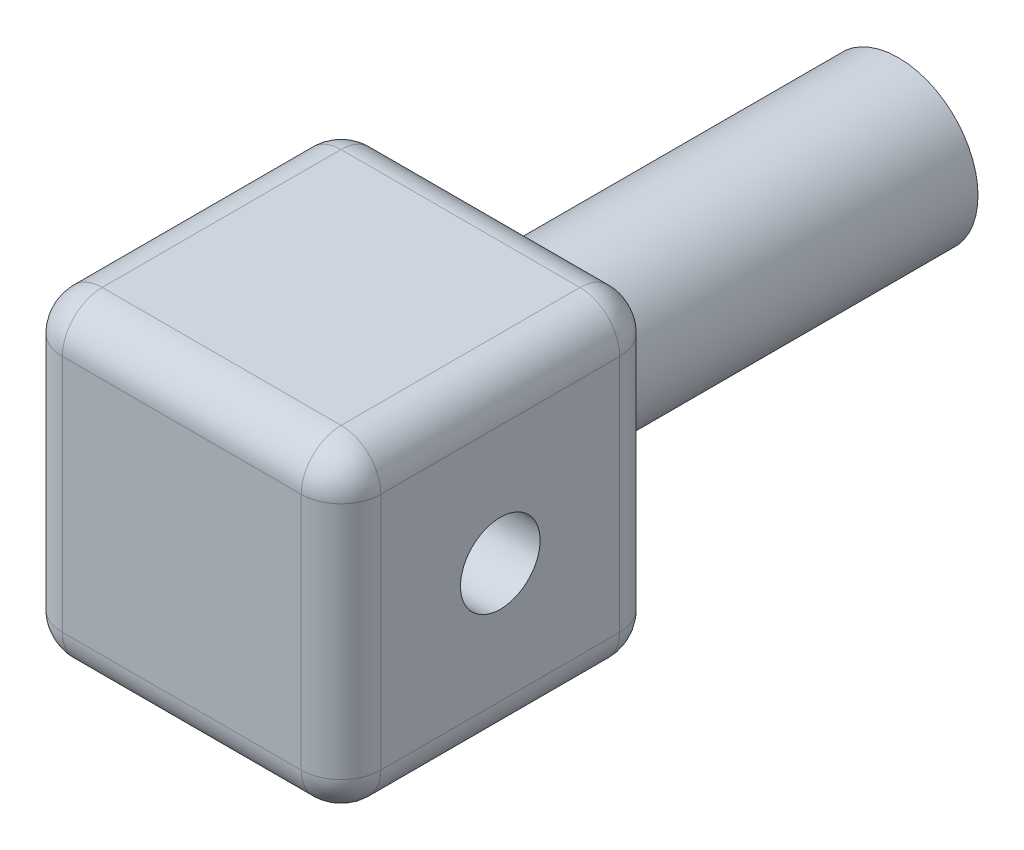
ISO-10303-21;
HEADER;
FILE_DESCRIPTION(('STEP AP214'),'2;1');
FILE_NAME('part.step','',(''),(''),'','','');
FILE_SCHEMA(('AUTOMOTIVE_DESIGN { 1 0 10303 214 1 1 1 1 }'));
ENDSEC;
DATA;
#1=APPLICATION_CONTEXT('core data for automotive mechanical design processes');
#2=APPLICATION_PROTOCOL_DEFINITION('international standard','automotive_design',2000,#1);
#3=PRODUCT_CONTEXT('',#1,'mechanical');
#4=PRODUCT('Part','Part','',(#3));
#5=PRODUCT_RELATED_PRODUCT_CATEGORY('part','',(#4));
#6=PRODUCT_DEFINITION_FORMATION('','',#4);
#7=PRODUCT_DEFINITION_CONTEXT('part definition',#1,'design');
#8=PRODUCT_DEFINITION('design','',#6,#7);
#9=PRODUCT_DEFINITION_SHAPE('','',#8);
#10=(LENGTH_UNIT() NAMED_UNIT(*) SI_UNIT(.MILLI.,.METRE.));
#11=(NAMED_UNIT(*) PLANE_ANGLE_UNIT() SI_UNIT($,.RADIAN.));
#12=(NAMED_UNIT(*) SI_UNIT($,.STERADIAN.) SOLID_ANGLE_UNIT());
#13=UNCERTAINTY_MEASURE_WITH_UNIT(LENGTH_MEASURE(1.E-05),#10,'distance_accuracy_value','');
#14=(GEOMETRIC_REPRESENTATION_CONTEXT(3) GLOBAL_UNCERTAINTY_ASSIGNED_CONTEXT((#13)) GLOBAL_UNIT_ASSIGNED_CONTEXT((#10,
#11,#12)) REPRESENTATION_CONTEXT('',''));
#15=CARTESIAN_POINT('',(0.,0.,0.));
#16=DIRECTION('',(0.,0.,1.));
#17=DIRECTION('',(1.,0.,0.));
#18=AXIS2_PLACEMENT_3D('',#15,#16,#17);
#19=CARTESIAN_POINT('',(40.,40.,80.));
#20=DIRECTION('',(-1.,0.,0.));
#21=DIRECTION('',(0.,-1.,0.));
#22=AXIS2_PLACEMENT_3D('',#19,#20,#21);
#23=PLANE('',#22);
#24=CARTESIAN_POINT('',(40.,0.,40.));
#25=DIRECTION('',(-1.,0.,0.));
#26=DIRECTION('',(0.,-1.,0.));
#27=AXIS2_PLACEMENT_3D('',#24,#25,#26);
#28=CIRCLE('',#27,10.);
#29=CARTESIAN_POINT('',(40.,-10.,40.));
#30=VERTEX_POINT('',#29);
#31=EDGE_CURVE('E392',#30,#30,#28,.F.);
#32=ORIENTED_EDGE('',*,*,#31,.F.);
#33=EDGE_LOOP('',(#32));
#34=FACE_BOUND('',#33,.T.);
#35=DIRECTION('',(0.,0.,-1.));
#36=VECTOR('',#35,1.);
#37=CARTESIAN_POINT('',(40.,30.,80.));
#38=LINE('',#37,#36);
#39=CARTESIAN_POINT('',(40.,30.,9.99999999999999));
#40=VERTEX_POINT('',#39);
#41=CARTESIAN_POINT('',(40.,30.,70.));
#42=VERTEX_POINT('',#41);
#43=EDGE_CURVE('E182',#40,#42,#38,.F.);
#44=ORIENTED_EDGE('',*,*,#43,.T.);
#45=DIRECTION('',(0.,1.,0.));
#46=VECTOR('',#45,1.);
#47=CARTESIAN_POINT('',(40.,-40.,70.));
#48=LINE('',#47,#46);
#49=CARTESIAN_POINT('',(40.,-30.,70.));
#50=VERTEX_POINT('',#49);
#51=EDGE_CURVE('E187',#42,#50,#48,.F.);
#52=ORIENTED_EDGE('',*,*,#51,.T.);
#53=DIRECTION('',(0.,0.,-1.));
#54=VECTOR('',#53,1.);
#55=CARTESIAN_POINT('',(40.,-30.,80.));
#56=LINE('',#55,#54);
#57=CARTESIAN_POINT('',(40.,-30.,9.99999999999999));
#58=VERTEX_POINT('',#57);
#59=EDGE_CURVE('E184',#50,#58,#56,.T.);
#60=ORIENTED_EDGE('',*,*,#59,.T.);
#61=DIRECTION('',(0.,1.,0.));
#62=VECTOR('',#61,1.);
#63=CARTESIAN_POINT('',(40.,40.,9.99999999999999));
#64=LINE('',#63,#62);
#65=EDGE_CURVE('E180',#58,#40,#64,.T.);
#66=ORIENTED_EDGE('',*,*,#65,.T.);
#67=EDGE_LOOP('',(#44,#52,#60,#66));
#68=FACE_BOUND('',#67,.T.);
#69=ADVANCED_FACE('F35',(#34,#68),#23,.F.);
#70=CARTESIAN_POINT('',(-40.,40.,80.));
#71=DIRECTION('',(0.,-1.,0.));
#72=DIRECTION('',(0.,0.,-1.));
#73=AXIS2_PLACEMENT_3D('',#70,#71,#72);
#74=PLANE('',#73);
#75=DIRECTION('',(-1.,0.,0.));
#76=VECTOR('',#75,1.);
#77=CARTESIAN_POINT('',(40.,40.,70.));
#78=LINE('',#77,#76);
#79=CARTESIAN_POINT('',(-30.,40.,70.));
#80=VERTEX_POINT('',#79);
#81=CARTESIAN_POINT('',(30.,40.,70.));
#82=VERTEX_POINT('',#81);
#83=EDGE_CURVE('E50',#80,#82,#78,.F.);
#84=ORIENTED_EDGE('',*,*,#83,.T.);
#85=DIRECTION('',(0.,0.,-1.));
#86=VECTOR('',#85,1.);
#87=CARTESIAN_POINT('',(30.,40.,80.));
#88=LINE('',#87,#86);
#89=CARTESIAN_POINT('',(30.,40.,9.99999999999999));
#90=VERTEX_POINT('',#89);
#91=EDGE_CURVE('E43',#82,#90,#88,.T.);
#92=ORIENTED_EDGE('',*,*,#91,.T.);
#93=DIRECTION('',(-1.,0.,0.));
#94=VECTOR('',#93,1.);
#95=CARTESIAN_POINT('',(-40.,40.,9.99999999999999));
#96=LINE('',#95,#94);
#97=CARTESIAN_POINT('',(-30.,40.,9.99999999999999));
#98=VERTEX_POINT('',#97);
#99=EDGE_CURVE('E198',#90,#98,#96,.T.);
#100=ORIENTED_EDGE('',*,*,#99,.T.);
#101=DIRECTION('',(0.,0.,-1.));
#102=VECTOR('',#101,1.);
#103=CARTESIAN_POINT('',(-30.,40.,80.));
#104=LINE('',#103,#102);
#105=EDGE_CURVE('E55',#98,#80,#104,.F.);
#106=ORIENTED_EDGE('',*,*,#105,.T.);
#107=EDGE_LOOP('',(#84,#92,#100,#106));
#108=FACE_BOUND('',#107,.T.);
#109=ADVANCED_FACE('F301',(#108),#74,.F.);
#110=CARTESIAN_POINT('',(-40.,40.,80.));
#111=DIRECTION('',(1.,0.,0.));
#112=DIRECTION('',(0.,1.,0.));
#113=AXIS2_PLACEMENT_3D('',#110,#111,#112);
#114=PLANE('',#113);
#115=CARTESIAN_POINT('',(-40.,0.,40.));
#116=DIRECTION('',(-1.,0.,0.));
#117=DIRECTION('',(0.,-1.,0.));
#118=AXIS2_PLACEMENT_3D('',#115,#116,#117);
#119=CIRCLE('',#118,10.);
#120=CARTESIAN_POINT('',(-40.,-10.,40.));
#121=VERTEX_POINT('',#120);
#122=EDGE_CURVE('E394',#121,#121,#119,.T.);
#123=ORIENTED_EDGE('',*,*,#122,.F.);
#124=EDGE_LOOP('',(#123));
#125=FACE_BOUND('',#124,.T.);
#126=DIRECTION('',(0.,0.,-1.));
#127=VECTOR('',#126,1.);
#128=CARTESIAN_POINT('',(-40.,-30.,80.));
#129=LINE('',#128,#127);
#130=CARTESIAN_POINT('',(-40.,-30.,9.99999999999999));
#131=VERTEX_POINT('',#130);
#132=CARTESIAN_POINT('',(-40.,-30.,70.));
#133=VERTEX_POINT('',#132);
#134=EDGE_CURVE('E130',#131,#133,#129,.F.);
#135=ORIENTED_EDGE('',*,*,#134,.T.);
#136=DIRECTION('',(0.,-1.,0.));
#137=VECTOR('',#136,1.);
#138=CARTESIAN_POINT('',(-40.,40.,70.));
#139=LINE('',#138,#137);
#140=CARTESIAN_POINT('',(-40.,30.,70.));
#141=VERTEX_POINT('',#140);
#142=EDGE_CURVE('E169',#133,#141,#139,.F.);
#143=ORIENTED_EDGE('',*,*,#142,.T.);
#144=DIRECTION('',(0.,0.,-1.));
#145=VECTOR('',#144,1.);
#146=CARTESIAN_POINT('',(-40.,30.,80.));
#147=LINE('',#146,#145);
#148=CARTESIAN_POINT('',(-40.,30.,9.99999999999999));
#149=VERTEX_POINT('',#148);
#150=EDGE_CURVE('E162',#141,#149,#147,.T.);
#151=ORIENTED_EDGE('',*,*,#150,.T.);
#152=DIRECTION('',(0.,-1.,0.));
#153=VECTOR('',#152,1.);
#154=CARTESIAN_POINT('',(-40.,40.,9.99999999999999));
#155=LINE('',#154,#153);
#156=EDGE_CURVE('E160',#149,#131,#155,.T.);
#157=ORIENTED_EDGE('',*,*,#156,.T.);
#158=EDGE_LOOP('',(#135,#143,#151,#157));
#159=FACE_BOUND('',#158,.T.);
#160=ADVANCED_FACE('F336',(#125,#159),#114,.F.);
#161=CARTESIAN_POINT('',(-40.,-40.,80.));
#162=DIRECTION('',(0.,1.,0.));
#163=DIRECTION('',(0.,0.,1.));
#164=AXIS2_PLACEMENT_3D('',#161,#162,#163);
#165=PLANE('',#164);
#166=DIRECTION('',(1.,0.,0.));
#167=VECTOR('',#166,1.);
#168=CARTESIAN_POINT('',(-40.,-40.,70.));
#169=LINE('',#168,#167);
#170=CARTESIAN_POINT('',(30.,-40.,70.));
#171=VERTEX_POINT('',#170);
#172=CARTESIAN_POINT('',(-30.,-40.,70.));
#173=VERTEX_POINT('',#172);
#174=EDGE_CURVE('E158',#171,#173,#169,.F.);
#175=ORIENTED_EDGE('',*,*,#174,.T.);
#176=DIRECTION('',(0.,0.,-1.));
#177=VECTOR('',#176,1.);
#178=CARTESIAN_POINT('',(-30.,-40.,80.));
#179=LINE('',#178,#177);
#180=CARTESIAN_POINT('',(-30.,-40.,9.99999999999999));
#181=VERTEX_POINT('',#180);
#182=EDGE_CURVE('E128',#173,#181,#179,.T.);
#183=ORIENTED_EDGE('',*,*,#182,.T.);
#184=DIRECTION('',(1.,0.,0.));
#185=VECTOR('',#184,1.);
#186=CARTESIAN_POINT('',(-40.,-40.,9.99999999999999));
#187=LINE('',#186,#185);
#188=CARTESIAN_POINT('',(30.,-40.,9.99999999999999));
#189=VERTEX_POINT('',#188);
#190=EDGE_CURVE('E147',#181,#189,#187,.T.);
#191=ORIENTED_EDGE('',*,*,#190,.T.);
#192=DIRECTION('',(0.,0.,-1.));
#193=VECTOR('',#192,1.);
#194=CARTESIAN_POINT('',(30.,-40.,80.));
#195=LINE('',#194,#193);
#196=EDGE_CURVE('E153',#189,#171,#195,.F.);
#197=ORIENTED_EDGE('',*,*,#196,.T.);
#198=EDGE_LOOP('',(#175,#183,#191,#197));
#199=FACE_BOUND('',#198,.T.);
#200=ADVANCED_FACE('F156',(#199),#165,.F.);
#201=CARTESIAN_POINT('',(0.,0.,80.));
#202=DIRECTION('',(0.,0.,1.));
#203=DIRECTION('',(1.,0.,0.));
#204=AXIS2_PLACEMENT_3D('',#201,#202,#203);
#205=PLANE('',#204);
#206=DIRECTION('',(-1.,0.,0.));
#207=VECTOR('',#206,1.);
#208=CARTESIAN_POINT('',(-40.,30.,80.));
#209=LINE('',#208,#207);
#210=CARTESIAN_POINT('',(30.,30.,80.));
#211=VERTEX_POINT('',#210);
#212=CARTESIAN_POINT('',(-30.,30.,80.));
#213=VERTEX_POINT('',#212);
#214=EDGE_CURVE('E173',#211,#213,#209,.T.);
#215=ORIENTED_EDGE('',*,*,#214,.T.);
#216=DIRECTION('',(0.,-1.,0.));
#217=VECTOR('',#216,1.);
#218=CARTESIAN_POINT('',(-30.,-40.,80.));
#219=LINE('',#218,#217);
#220=CARTESIAN_POINT('',(-30.,-30.,80.));
#221=VERTEX_POINT('',#220);
#222=EDGE_CURVE('E178',#213,#221,#219,.T.);
#223=ORIENTED_EDGE('',*,*,#222,.T.);
#224=DIRECTION('',(1.,0.,0.));
#225=VECTOR('',#224,1.);
#226=CARTESIAN_POINT('',(40.,-30.,80.));
#227=LINE('',#226,#225);
#228=CARTESIAN_POINT('',(30.,-30.,80.));
#229=VERTEX_POINT('',#228);
#230=EDGE_CURVE('E175',#221,#229,#227,.T.);
#231=ORIENTED_EDGE('',*,*,#230,.T.);
#232=DIRECTION('',(0.,1.,0.));
#233=VECTOR('',#232,1.);
#234=CARTESIAN_POINT('',(30.,40.,80.));
#235=LINE('',#234,#233);
#236=EDGE_CURVE('E171',#229,#211,#235,.T.);
#237=ORIENTED_EDGE('',*,*,#236,.T.);
#238=EDGE_LOOP('',(#215,#223,#231,#237));
#239=FACE_BOUND('',#238,.T.);
#240=ADVANCED_FACE('F272',(#239),#205,.T.);
#241=CARTESIAN_POINT('',(0.,0.,0.));
#242=DIRECTION('',(0.,0.,1.));
#243=DIRECTION('',(1.,0.,0.));
#244=AXIS2_PLACEMENT_3D('',#241,#242,#243);
#245=PLANE('',#244);
#246=CARTESIAN_POINT('',(0.,0.,0.));
#247=DIRECTION('',(0.,0.,1.));
#248=DIRECTION('',(1.,0.,0.));
#249=AXIS2_PLACEMENT_3D('',#246,#247,#248);
#250=CIRCLE('',#249,20.);
#251=CARTESIAN_POINT('',(20.,0.,0.));
#252=VERTEX_POINT('',#251);
#253=EDGE_CURVE('E12',#252,#252,#250,.F.);
#254=ORIENTED_EDGE('',*,*,#253,.F.);
#255=EDGE_LOOP('',(#254));
#256=FACE_BOUND('',#255,.T.);
#257=DIRECTION('',(1.,0.,0.));
#258=VECTOR('',#257,1.);
#259=CARTESIAN_POINT('',(0.,-30.,0.));
#260=LINE('',#259,#258);
#261=CARTESIAN_POINT('',(30.,-30.,0.));
#262=VERTEX_POINT('',#261);
#263=CARTESIAN_POINT('',(-30.,-30.,0.));
#264=VERTEX_POINT('',#263);
#265=EDGE_CURVE('E193',#262,#264,#260,.F.);
#266=ORIENTED_EDGE('',*,*,#265,.T.);
#267=DIRECTION('',(0.,-1.,0.));
#268=VECTOR('',#267,1.);
#269=CARTESIAN_POINT('',(-30.,0.,0.));
#270=LINE('',#269,#268);
#271=CARTESIAN_POINT('',(-30.,30.,0.));
#272=VERTEX_POINT('',#271);
#273=EDGE_CURVE('E196',#264,#272,#270,.F.);
#274=ORIENTED_EDGE('',*,*,#273,.T.);
#275=DIRECTION('',(-1.,0.,0.));
#276=VECTOR('',#275,1.);
#277=CARTESIAN_POINT('',(0.,30.,0.));
#278=LINE('',#277,#276);
#279=CARTESIAN_POINT('',(30.,30.,0.));
#280=VERTEX_POINT('',#279);
#281=EDGE_CURVE('E191',#272,#280,#278,.F.);
#282=ORIENTED_EDGE('',*,*,#281,.T.);
#283=DIRECTION('',(0.,1.,0.));
#284=VECTOR('',#283,1.);
#285=CARTESIAN_POINT('',(30.,0.,0.));
#286=LINE('',#285,#284);
#287=EDGE_CURVE('E189',#280,#262,#286,.F.);
#288=ORIENTED_EDGE('',*,*,#287,.T.);
#289=EDGE_LOOP('',(#266,#274,#282,#288));
#290=FACE_BOUND('',#289,.T.);
#291=ADVANCED_FACE('F372',(#256,#290),#245,.F.);
#292=CARTESIAN_POINT('',(30.,30.,80.));
#293=DIRECTION('',(0.,0.,-1.));
#294=DIRECTION('',(-1.,0.,0.));
#295=AXIS2_PLACEMENT_3D('',#292,#293,#294);
#296=CYLINDRICAL_SURFACE('',#295,10.);
#297=CARTESIAN_POINT('',(30.,30.,70.));
#298=DIRECTION('',(0.,0.,1.));
#299=DIRECTION('',(1.,0.,0.));
#300=AXIS2_PLACEMENT_3D('',#297,#298,#299);
#301=CIRCLE('',#300,10.);
#302=EDGE_CURVE('E154',#42,#82,#301,.T.);
#303=ORIENTED_EDGE('',*,*,#302,.F.);
#304=ORIENTED_EDGE('',*,*,#43,.F.);
#305=CARTESIAN_POINT('',(30.,30.,9.99999999999999));
#306=DIRECTION('',(0.,0.,-1.));
#307=DIRECTION('',(-1.,0.,0.));
#308=AXIS2_PLACEMENT_3D('',#305,#306,#307);
#309=CIRCLE('',#308,10.);
#310=EDGE_CURVE('E254',#90,#40,#309,.T.);
#311=ORIENTED_EDGE('',*,*,#310,.F.);
#312=ORIENTED_EDGE('',*,*,#91,.F.);
#313=EDGE_LOOP('',(#303,#304,#311,#312));
#314=FACE_BOUND('',#313,.T.);
#315=ADVANCED_FACE('F37',(#314),#296,.T.);
#316=CARTESIAN_POINT('',(30.,30.,70.));
#317=DIRECTION('',(0.,0.,1.));
#318=DIRECTION('',(1.,0.,0.));
#319=AXIS2_PLACEMENT_3D('',#316,#317,#318);
#320=SPHERICAL_SURFACE('',#319,10.);
#321=CARTESIAN_POINT('',(30.,30.,70.));
#322=DIRECTION('',(0.,1.,0.));
#323=DIRECTION('',(0.,0.,1.));
#324=AXIS2_PLACEMENT_3D('',#321,#322,#323);
#325=CIRCLE('',#324,10.);
#326=EDGE_CURVE('E248',#42,#211,#325,.F.);
#327=ORIENTED_EDGE('',*,*,#326,.F.);
#328=ORIENTED_EDGE('',*,*,#302,.T.);
#329=CARTESIAN_POINT('',(30.,30.,70.));
#330=DIRECTION('',(1.,0.,0.));
#331=DIRECTION('',(0.,0.,-1.));
#332=AXIS2_PLACEMENT_3D('',#329,#330,#331);
#333=CIRCLE('',#332,10.);
#334=EDGE_CURVE('E251',#211,#82,#333,.F.);
#335=ORIENTED_EDGE('',*,*,#334,.F.);
#336=EDGE_LOOP('',(#327,#328,#335));
#337=FACE_BOUND('',#336,.T.);
#338=ADVANCED_FACE('F261',(#337),#320,.T.);
#339=CARTESIAN_POINT('',(30.,30.,10.));
#340=DIRECTION('',(0.,0.,1.));
#341=DIRECTION('',(1.,0.,0.));
#342=AXIS2_PLACEMENT_3D('',#339,#340,#341);
#343=SPHERICAL_SURFACE('',#342,10.);
#344=CARTESIAN_POINT('',(30.,30.,10.));
#345=DIRECTION('',(1.,0.,0.));
#346=DIRECTION('',(0.,1.,0.));
#347=AXIS2_PLACEMENT_3D('',#344,#345,#346);
#348=CIRCLE('',#347,10.);
#349=EDGE_CURVE('E242',#90,#280,#348,.F.);
#350=ORIENTED_EDGE('',*,*,#349,.F.);
#351=ORIENTED_EDGE('',*,*,#310,.T.);
#352=CARTESIAN_POINT('',(30.,30.,9.99999999999999));
#353=DIRECTION('',(0.,1.,0.));
#354=DIRECTION('',(0.,0.,1.));
#355=AXIS2_PLACEMENT_3D('',#352,#353,#354);
#356=CIRCLE('',#355,10.);
#357=EDGE_CURVE('E245',#280,#40,#356,.F.);
#358=ORIENTED_EDGE('',*,*,#357,.F.);
#359=EDGE_LOOP('',(#350,#351,#358));
#360=FACE_BOUND('',#359,.T.);
#361=ADVANCED_FACE('F296',(#360),#343,.T.);
#362=CARTESIAN_POINT('',(0.,30.,70.));
#363=DIRECTION('',(1.,0.,0.));
#364=DIRECTION('',(0.,0.,-1.));
#365=AXIS2_PLACEMENT_3D('',#362,#363,#364);
#366=CYLINDRICAL_SURFACE('',#365,10.);
#367=ORIENTED_EDGE('',*,*,#334,.T.);
#368=ORIENTED_EDGE('',*,*,#83,.F.);
#369=CARTESIAN_POINT('',(-30.,30.,70.));
#370=DIRECTION('',(-1.,0.,0.));
#371=DIRECTION('',(0.,0.,1.));
#372=AXIS2_PLACEMENT_3D('',#369,#370,#371);
#373=CIRCLE('',#372,10.);
#374=EDGE_CURVE('E236',#213,#80,#373,.T.);
#375=ORIENTED_EDGE('',*,*,#374,.F.);
#376=ORIENTED_EDGE('',*,*,#214,.F.);
#377=EDGE_LOOP('',(#367,#368,#375,#376));
#378=FACE_BOUND('',#377,.T.);
#379=ADVANCED_FACE('F267',(#378),#366,.T.);
#380=CARTESIAN_POINT('',(30.,0.,70.));
#381=DIRECTION('',(0.,-1.,0.));
#382=DIRECTION('',(1.,0.,0.));
#383=AXIS2_PLACEMENT_3D('',#380,#381,#382);
#384=CYLINDRICAL_SURFACE('',#383,10.);
#385=ORIENTED_EDGE('',*,*,#326,.T.);
#386=ORIENTED_EDGE('',*,*,#236,.F.);
#387=CARTESIAN_POINT('',(30.,-30.,70.));
#388=DIRECTION('',(0.,-1.,0.));
#389=DIRECTION('',(0.,0.,-1.));
#390=AXIS2_PLACEMENT_3D('',#387,#388,#389);
#391=CIRCLE('',#390,10.);
#392=EDGE_CURVE('E233',#50,#229,#391,.T.);
#393=ORIENTED_EDGE('',*,*,#392,.F.);
#394=ORIENTED_EDGE('',*,*,#51,.F.);
#395=EDGE_LOOP('',(#385,#386,#393,#394));
#396=FACE_BOUND('',#395,.T.);
#397=ADVANCED_FACE('F278',(#396),#384,.T.);
#398=CARTESIAN_POINT('',(30.,-30.,80.));
#399=DIRECTION('',(0.,0.,-1.));
#400=DIRECTION('',(-1.,0.,0.));
#401=AXIS2_PLACEMENT_3D('',#398,#399,#400);
#402=CYLINDRICAL_SURFACE('',#401,10.);
#403=CARTESIAN_POINT('',(30.,-30.,9.99999999999999));
#404=DIRECTION('',(0.,0.,-1.));
#405=DIRECTION('',(-1.,0.,0.));
#406=AXIS2_PLACEMENT_3D('',#403,#404,#405);
#407=CIRCLE('',#406,10.);
#408=EDGE_CURVE('E227',#58,#189,#407,.T.);
#409=ORIENTED_EDGE('',*,*,#408,.F.);
#410=ORIENTED_EDGE('',*,*,#59,.F.);
#411=CARTESIAN_POINT('',(30.,-30.,70.));
#412=DIRECTION('',(0.,0.,1.));
#413=DIRECTION('',(1.,0.,0.));
#414=AXIS2_PLACEMENT_3D('',#411,#412,#413);
#415=CIRCLE('',#414,10.);
#416=EDGE_CURVE('E230',#171,#50,#415,.T.);
#417=ORIENTED_EDGE('',*,*,#416,.F.);
#418=ORIENTED_EDGE('',*,*,#196,.F.);
#419=EDGE_LOOP('',(#409,#410,#417,#418));
#420=FACE_BOUND('',#419,.T.);
#421=ADVANCED_FACE('F284',(#420),#402,.T.);
#422=CARTESIAN_POINT('',(30.,40.,9.99999999999999));
#423=DIRECTION('',(0.,1.,0.));
#424=DIRECTION('',(-1.,0.,0.));
#425=AXIS2_PLACEMENT_3D('',#422,#423,#424);
#426=CYLINDRICAL_SURFACE('',#425,10.);
#427=ORIENTED_EDGE('',*,*,#357,.T.);
#428=ORIENTED_EDGE('',*,*,#65,.F.);
#429=CARTESIAN_POINT('',(30.,-30.,10.));
#430=DIRECTION('',(0.,-1.,0.));
#431=DIRECTION('',(1.,0.,0.));
#432=AXIS2_PLACEMENT_3D('',#429,#430,#431);
#433=CIRCLE('',#432,10.);
#434=EDGE_CURVE('E225',#262,#58,#433,.T.);
#435=ORIENTED_EDGE('',*,*,#434,.F.);
#436=ORIENTED_EDGE('',*,*,#287,.F.);
#437=EDGE_LOOP('',(#427,#428,#435,#436));
#438=FACE_BOUND('',#437,.T.);
#439=ADVANCED_FACE('F290',(#438),#426,.T.);
#440=CARTESIAN_POINT('',(-40.,30.,9.99999999999999));
#441=DIRECTION('',(-1.,0.,0.));
#442=DIRECTION('',(0.,0.,1.));
#443=AXIS2_PLACEMENT_3D('',#440,#441,#442);
#444=CYLINDRICAL_SURFACE('',#443,10.);
#445=ORIENTED_EDGE('',*,*,#349,.T.);
#446=ORIENTED_EDGE('',*,*,#281,.F.);
#447=CARTESIAN_POINT('',(-30.,30.,9.99999999999999));
#448=DIRECTION('',(-1.,0.,0.));
#449=DIRECTION('',(0.,0.,1.));
#450=AXIS2_PLACEMENT_3D('',#447,#448,#449);
#451=CIRCLE('',#450,10.);
#452=EDGE_CURVE('E222',#98,#272,#451,.T.);
#453=ORIENTED_EDGE('',*,*,#452,.F.);
#454=ORIENTED_EDGE('',*,*,#99,.F.);
#455=EDGE_LOOP('',(#445,#446,#453,#454));
#456=FACE_BOUND('',#455,.T.);
#457=ADVANCED_FACE('F299',(#456),#444,.T.);
#458=CARTESIAN_POINT('',(-30.,30.,80.));
#459=DIRECTION('',(0.,0.,-1.));
#460=DIRECTION('',(-1.,0.,0.));
#461=AXIS2_PLACEMENT_3D('',#458,#459,#460);
#462=CYLINDRICAL_SURFACE('',#461,10.);
#463=CARTESIAN_POINT('',(-30.,30.,70.));
#464=DIRECTION('',(0.,0.,1.));
#465=DIRECTION('',(1.,0.,0.));
#466=AXIS2_PLACEMENT_3D('',#463,#464,#465);
#467=CIRCLE('',#466,10.);
#468=EDGE_CURVE('E239',#80,#141,#467,.T.);
#469=ORIENTED_EDGE('',*,*,#468,.F.);
#470=ORIENTED_EDGE('',*,*,#105,.F.);
#471=CARTESIAN_POINT('',(-30.,30.,9.99999999999999));
#472=DIRECTION('',(0.,0.,-1.));
#473=DIRECTION('',(-1.,0.,0.));
#474=AXIS2_PLACEMENT_3D('',#471,#472,#473);
#475=CIRCLE('',#474,10.);
#476=EDGE_CURVE('E219',#149,#98,#475,.T.);
#477=ORIENTED_EDGE('',*,*,#476,.F.);
#478=ORIENTED_EDGE('',*,*,#150,.F.);
#479=EDGE_LOOP('',(#469,#470,#477,#478));
#480=FACE_BOUND('',#479,.T.);
#481=ADVANCED_FACE('F304',(#480),#462,.T.);
#482=CARTESIAN_POINT('',(-30.,30.,70.));
#483=DIRECTION('',(0.,0.,1.));
#484=DIRECTION('',(1.,0.,0.));
#485=AXIS2_PLACEMENT_3D('',#482,#483,#484);
#486=SPHERICAL_SURFACE('',#485,10.);
#487=ORIENTED_EDGE('',*,*,#374,.T.);
#488=ORIENTED_EDGE('',*,*,#468,.T.);
#489=CARTESIAN_POINT('',(-30.,30.,70.));
#490=DIRECTION('',(0.,1.,0.));
#491=DIRECTION('',(0.,0.,1.));
#492=AXIS2_PLACEMENT_3D('',#489,#490,#491);
#493=CIRCLE('',#492,10.);
#494=EDGE_CURVE('E216',#213,#141,#493,.F.);
#495=ORIENTED_EDGE('',*,*,#494,.F.);
#496=EDGE_LOOP('',(#487,#488,#495));
#497=FACE_BOUND('',#496,.T.);
#498=ADVANCED_FACE('F308',(#497),#486,.T.);
#499=CARTESIAN_POINT('',(30.,-30.,70.));
#500=DIRECTION('',(0.,0.,1.));
#501=DIRECTION('',(1.,0.,0.));
#502=AXIS2_PLACEMENT_3D('',#499,#500,#501);
#503=SPHERICAL_SURFACE('',#502,10.);
#504=ORIENTED_EDGE('',*,*,#416,.T.);
#505=ORIENTED_EDGE('',*,*,#392,.T.);
#506=CARTESIAN_POINT('',(30.,-30.,70.));
#507=DIRECTION('',(1.,0.,0.));
#508=DIRECTION('',(0.,0.,-1.));
#509=AXIS2_PLACEMENT_3D('',#506,#507,#508);
#510=CIRCLE('',#509,10.);
#511=EDGE_CURVE('E214',#171,#229,#510,.F.);
#512=ORIENTED_EDGE('',*,*,#511,.F.);
#513=EDGE_LOOP('',(#504,#505,#512));
#514=FACE_BOUND('',#513,.T.);
#515=ADVANCED_FACE('F319',(#514),#503,.T.);
#516=CARTESIAN_POINT('',(30.,-30.,10.));
#517=DIRECTION('',(0.,0.,1.));
#518=DIRECTION('',(1.,0.,0.));
#519=AXIS2_PLACEMENT_3D('',#516,#517,#518);
#520=SPHERICAL_SURFACE('',#519,10.);
#521=ORIENTED_EDGE('',*,*,#434,.T.);
#522=ORIENTED_EDGE('',*,*,#408,.T.);
#523=CARTESIAN_POINT('',(30.,-30.,9.99999999999999));
#524=DIRECTION('',(1.,0.,0.));
#525=DIRECTION('',(0.,0.,-1.));
#526=AXIS2_PLACEMENT_3D('',#523,#524,#525);
#527=CIRCLE('',#526,10.);
#528=EDGE_CURVE('E150',#262,#189,#527,.F.);
#529=ORIENTED_EDGE('',*,*,#528,.F.);
#530=EDGE_LOOP('',(#521,#522,#529));
#531=FACE_BOUND('',#530,.T.);
#532=ADVANCED_FACE('F321',(#531),#520,.T.);
#533=CARTESIAN_POINT('',(-30.,30.,10.));
#534=DIRECTION('',(0.,0.,1.));
#535=DIRECTION('',(1.,0.,0.));
#536=AXIS2_PLACEMENT_3D('',#533,#534,#535);
#537=SPHERICAL_SURFACE('',#536,10.);
#538=ORIENTED_EDGE('',*,*,#476,.T.);
#539=ORIENTED_EDGE('',*,*,#452,.T.);
#540=CARTESIAN_POINT('',(-30.,30.,10.));
#541=DIRECTION('',(0.,1.,0.));
#542=DIRECTION('',(0.,0.,1.));
#543=AXIS2_PLACEMENT_3D('',#540,#541,#542);
#544=CIRCLE('',#543,10.);
#545=EDGE_CURVE('E210',#149,#272,#544,.F.);
#546=ORIENTED_EDGE('',*,*,#545,.F.);
#547=EDGE_LOOP('',(#538,#539,#546));
#548=FACE_BOUND('',#547,.T.);
#549=ADVANCED_FACE('F327',(#548),#537,.T.);
#550=CARTESIAN_POINT('',(-30.,0.,70.));
#551=DIRECTION('',(0.,1.,0.));
#552=DIRECTION('',(-1.,0.,0.));
#553=AXIS2_PLACEMENT_3D('',#550,#551,#552);
#554=CYLINDRICAL_SURFACE('',#553,10.);
#555=ORIENTED_EDGE('',*,*,#494,.T.);
#556=ORIENTED_EDGE('',*,*,#142,.F.);
#557=CARTESIAN_POINT('',(-30.,-30.,70.));
#558=DIRECTION('',(0.,-1.,0.));
#559=DIRECTION('',(0.,0.,-1.));
#560=AXIS2_PLACEMENT_3D('',#557,#558,#559);
#561=CIRCLE('',#560,10.);
#562=EDGE_CURVE('E207',#221,#133,#561,.T.);
#563=ORIENTED_EDGE('',*,*,#562,.F.);
#564=ORIENTED_EDGE('',*,*,#222,.F.);
#565=EDGE_LOOP('',(#555,#556,#563,#564));
#566=FACE_BOUND('',#565,.T.);
#567=ADVANCED_FACE('F312',(#566),#554,.T.);
#568=CARTESIAN_POINT('',(0.,-30.,70.));
#569=DIRECTION('',(-1.,0.,0.));
#570=DIRECTION('',(0.,0.,1.));
#571=AXIS2_PLACEMENT_3D('',#568,#569,#570);
#572=CYLINDRICAL_SURFACE('',#571,10.);
#573=ORIENTED_EDGE('',*,*,#511,.T.);
#574=ORIENTED_EDGE('',*,*,#230,.F.);
#575=CARTESIAN_POINT('',(-30.,-30.,70.));
#576=DIRECTION('',(-1.,0.,0.));
#577=DIRECTION('',(0.,0.,1.));
#578=AXIS2_PLACEMENT_3D('',#575,#576,#577);
#579=CIRCLE('',#578,10.);
#580=EDGE_CURVE('E144',#173,#221,#579,.T.);
#581=ORIENTED_EDGE('',*,*,#580,.F.);
#582=ORIENTED_EDGE('',*,*,#174,.F.);
#583=EDGE_LOOP('',(#573,#574,#581,#582));
#584=FACE_BOUND('',#583,.T.);
#585=ADVANCED_FACE('F317',(#584),#572,.T.);
#586=CARTESIAN_POINT('',(-40.,-30.,9.99999999999999));
#587=DIRECTION('',(1.,0.,0.));
#588=DIRECTION('',(0.,0.,-1.));
#589=AXIS2_PLACEMENT_3D('',#586,#587,#588);
#590=CYLINDRICAL_SURFACE('',#589,10.);
#591=ORIENTED_EDGE('',*,*,#528,.T.);
#592=ORIENTED_EDGE('',*,*,#190,.F.);
#593=CARTESIAN_POINT('',(-30.,-30.,10.));
#594=DIRECTION('',(-1.,0.,0.));
#595=DIRECTION('',(0.,0.,1.));
#596=AXIS2_PLACEMENT_3D('',#593,#594,#595);
#597=CIRCLE('',#596,10.);
#598=EDGE_CURVE('E136',#264,#181,#597,.T.);
#599=ORIENTED_EDGE('',*,*,#598,.F.);
#600=ORIENTED_EDGE('',*,*,#265,.F.);
#601=EDGE_LOOP('',(#591,#592,#599,#600));
#602=FACE_BOUND('',#601,.T.);
#603=ADVANCED_FACE('F148',(#602),#590,.T.);
#604=CARTESIAN_POINT('',(-30.,40.,9.99999999999999));
#605=DIRECTION('',(0.,-1.,0.));
#606=DIRECTION('',(1.,0.,0.));
#607=AXIS2_PLACEMENT_3D('',#604,#605,#606);
#608=CYLINDRICAL_SURFACE('',#607,10.);
#609=ORIENTED_EDGE('',*,*,#545,.T.);
#610=ORIENTED_EDGE('',*,*,#273,.F.);
#611=CARTESIAN_POINT('',(-30.,-30.,9.99999999999999));
#612=DIRECTION('',(0.,-1.,0.));
#613=DIRECTION('',(0.,0.,-1.));
#614=AXIS2_PLACEMENT_3D('',#611,#612,#613);
#615=CIRCLE('',#614,10.);
#616=EDGE_CURVE('E140',#131,#264,#615,.T.);
#617=ORIENTED_EDGE('',*,*,#616,.F.);
#618=ORIENTED_EDGE('',*,*,#156,.F.);
#619=EDGE_LOOP('',(#609,#610,#617,#618));
#620=FACE_BOUND('',#619,.T.);
#621=ADVANCED_FACE('F348',(#620),#608,.T.);
#622=CARTESIAN_POINT('',(-30.,-30.,70.));
#623=DIRECTION('',(0.,0.,1.));
#624=DIRECTION('',(1.,0.,0.));
#625=AXIS2_PLACEMENT_3D('',#622,#623,#624);
#626=SPHERICAL_SURFACE('',#625,10.);
#627=ORIENTED_EDGE('',*,*,#580,.T.);
#628=ORIENTED_EDGE('',*,*,#562,.T.);
#629=CARTESIAN_POINT('',(-30.,-30.,70.));
#630=DIRECTION('',(0.,0.,1.));
#631=DIRECTION('',(1.,0.,0.));
#632=AXIS2_PLACEMENT_3D('',#629,#630,#631);
#633=CIRCLE('',#632,10.);
#634=EDGE_CURVE('E132',#173,#133,#633,.F.);
#635=ORIENTED_EDGE('',*,*,#634,.F.);
#636=EDGE_LOOP('',(#627,#628,#635));
#637=FACE_BOUND('',#636,.T.);
#638=ADVANCED_FACE('F315',(#637),#626,.T.);
#639=CARTESIAN_POINT('',(-30.,-30.,10.));
#640=DIRECTION('',(0.,0.,1.));
#641=DIRECTION('',(1.,0.,0.));
#642=AXIS2_PLACEMENT_3D('',#639,#640,#641);
#643=SPHERICAL_SURFACE('',#642,10.);
#644=ORIENTED_EDGE('',*,*,#616,.T.);
#645=ORIENTED_EDGE('',*,*,#598,.T.);
#646=CARTESIAN_POINT('',(-30.,-30.,9.99999999999999));
#647=DIRECTION('',(0.,0.,-1.));
#648=DIRECTION('',(-1.,0.,0.));
#649=AXIS2_PLACEMENT_3D('',#646,#647,#648);
#650=CIRCLE('',#649,10.);
#651=EDGE_CURVE('E124',#131,#181,#650,.F.);
#652=ORIENTED_EDGE('',*,*,#651,.F.);
#653=EDGE_LOOP('',(#644,#645,#652));
#654=FACE_BOUND('',#653,.T.);
#655=ADVANCED_FACE('F138',(#654),#643,.T.);
#656=CARTESIAN_POINT('',(-30.,-30.,80.));
#657=DIRECTION('',(0.,0.,-1.));
#658=DIRECTION('',(-1.,0.,0.));
#659=AXIS2_PLACEMENT_3D('',#656,#657,#658);
#660=CYLINDRICAL_SURFACE('',#659,10.);
#661=ORIENTED_EDGE('',*,*,#634,.T.);
#662=ORIENTED_EDGE('',*,*,#134,.F.);
#663=ORIENTED_EDGE('',*,*,#651,.T.);
#664=ORIENTED_EDGE('',*,*,#182,.F.);
#665=EDGE_LOOP('',(#661,#662,#663,#664));
#666=FACE_BOUND('',#665,.T.);
#667=ADVANCED_FACE('F126',(#666),#660,.T.);
#668=CARTESIAN_POINT('',(0.,0.,-100.));
#669=DIRECTION('',(0.,0.,1.));
#670=DIRECTION('',(1.,0.,0.));
#671=AXIS2_PLACEMENT_3D('',#668,#669,#670);
#672=CYLINDRICAL_SURFACE('',#671,20.);
#673=CARTESIAN_POINT('',(0.,0.,-100.));
#674=DIRECTION('',(0.,0.,-1.));
#675=DIRECTION('',(-1.,0.,0.));
#676=AXIS2_PLACEMENT_3D('',#673,#674,#675);
#677=CIRCLE('',#676,20.);
#678=CARTESIAN_POINT('',(-20.,0.,-100.));
#679=VERTEX_POINT('',#678);
#680=EDGE_CURVE('E133',#679,#679,#677,.T.);
#681=ORIENTED_EDGE('',*,*,#680,.F.);
#682=EDGE_LOOP('',(#681));
#683=FACE_BOUND('',#682,.T.);
#684=ORIENTED_EDGE('',*,*,#253,.T.);
#685=EDGE_LOOP('',(#684));
#686=FACE_BOUND('',#685,.T.);
#687=ADVANCED_FACE('F343',(#683,#686),#672,.T.);
#688=CARTESIAN_POINT('',(0.,0.,-100.));
#689=DIRECTION('',(0.,0.,-1.));
#690=DIRECTION('',(-1.,0.,0.));
#691=AXIS2_PLACEMENT_3D('',#688,#689,#690);
#692=PLANE('',#691);
#693=ORIENTED_EDGE('',*,*,#680,.T.);
#694=EDGE_LOOP('',(#693));
#695=FACE_BOUND('',#694,.T.);
#696=ADVANCED_FACE('F380',(#695),#692,.T.);
#697=CARTESIAN_POINT('',(68.2842712474619,0.,40.));
#698=DIRECTION('',(-1.,0.,0.));
#699=DIRECTION('',(0.,-1.,0.));
#700=AXIS2_PLACEMENT_3D('',#697,#698,#699);
#701=CYLINDRICAL_SURFACE('',#700,10.);
#702=CARTESIAN_POINT('',(40.,-10.,40.));
#703=CARTESIAN_POINT('',(39.1666666666667,-10.,40.));
#704=CARTESIAN_POINT('',(38.3333333333333,-10.,40.));
#705=CARTESIAN_POINT('',(36.6666666666667,-10.,40.));
#706=CARTESIAN_POINT('',(35.8333333333333,-10.,40.));
#707=CARTESIAN_POINT('',(34.1666666666667,-10.,40.));
#708=CARTESIAN_POINT('',(33.3333333333333,-10.,40.));
#709=CARTESIAN_POINT('',(31.6666666666667,-10.,40.));
#710=CARTESIAN_POINT('',(30.8333333333333,-10.,40.));
#711=CARTESIAN_POINT('',(29.1666666666667,-10.,40.));
#712=CARTESIAN_POINT('',(28.3333333333333,-10.,40.));
#713=CARTESIAN_POINT('',(26.6666666666667,-10.,40.));
#714=CARTESIAN_POINT('',(25.8333333333333,-10.,40.));
#715=CARTESIAN_POINT('',(24.1666666666667,-10.,40.));
#716=CARTESIAN_POINT('',(23.3333333333333,-10.,40.));
#717=CARTESIAN_POINT('',(21.6666666666667,-10.,40.));
#718=CARTESIAN_POINT('',(20.8333333333333,-10.,40.));
#719=CARTESIAN_POINT('',(19.1666666666667,-10.,40.));
#720=CARTESIAN_POINT('',(18.3333333333333,-10.,40.));
#721=CARTESIAN_POINT('',(16.6666666666667,-10.,40.));
#722=CARTESIAN_POINT('',(15.8333333333333,-10.,40.));
#723=CARTESIAN_POINT('',(14.1666666666667,-10.,40.));
#724=CARTESIAN_POINT('',(13.3333333333333,-10.,40.));
#725=CARTESIAN_POINT('',(11.6666666666667,-10.,40.));
#726=CARTESIAN_POINT('',(10.8333333333333,-10.,40.));
#727=CARTESIAN_POINT('',(9.16666666666667,-10.,40.));
#728=CARTESIAN_POINT('',(8.33333333333333,-10.,40.));
#729=CARTESIAN_POINT('',(6.66666666666667,-10.,40.));
#730=CARTESIAN_POINT('',(5.83333333333334,-10.,40.));
#731=CARTESIAN_POINT('',(4.16666666666667,-10.,40.));
#732=CARTESIAN_POINT('',(3.33333333333335,-10.,40.));
#733=CARTESIAN_POINT('',(1.66666666666668,-10.,40.));
#734=CARTESIAN_POINT('',(0.833333333333348,-10.,40.));
#735=CARTESIAN_POINT('',(-0.83333333333332,-10.,40.));
#736=CARTESIAN_POINT('',(-1.66666666666665,-10.,40.));
#737=CARTESIAN_POINT('',(-3.33333333333332,-10.,40.));
#738=CARTESIAN_POINT('',(-4.16666666666666,-10.,40.));
#739=CARTESIAN_POINT('',(-5.83333333333332,-10.,40.));
#740=CARTESIAN_POINT('',(-6.66666666666666,-10.,40.));
#741=CARTESIAN_POINT('',(-8.33333333333333,-10.,40.));
#742=CARTESIAN_POINT('',(-9.16666666666666,-10.,40.));
#743=CARTESIAN_POINT('',(-10.8333333333333,-10.,40.));
#744=CARTESIAN_POINT('',(-11.6666666666667,-10.,40.));
#745=CARTESIAN_POINT('',(-13.3333333333333,-10.,40.));
#746=CARTESIAN_POINT('',(-14.1666666666667,-10.,40.));
#747=CARTESIAN_POINT('',(-15.8333333333333,-10.,40.));
#748=CARTESIAN_POINT('',(-16.6666666666667,-10.,40.));
#749=CARTESIAN_POINT('',(-18.3333333333333,-10.,40.));
#750=CARTESIAN_POINT('',(-19.1666666666667,-10.,40.));
#751=CARTESIAN_POINT('',(-20.8333333333333,-10.,40.));
#752=CARTESIAN_POINT('',(-21.6666666666667,-10.,40.));
#753=CARTESIAN_POINT('',(-23.3333333333333,-10.,40.));
#754=CARTESIAN_POINT('',(-24.1666666666667,-10.,40.));
#755=CARTESIAN_POINT('',(-25.8333333333333,-10.,40.));
#756=CARTESIAN_POINT('',(-26.6666666666667,-10.,40.));
#757=CARTESIAN_POINT('',(-28.3333333333333,-10.,40.));
#758=CARTESIAN_POINT('',(-29.1666666666667,-10.,40.));
#759=CARTESIAN_POINT('',(-30.8333333333333,-10.,40.));
#760=CARTESIAN_POINT('',(-31.6666666666667,-10.,40.));
#761=CARTESIAN_POINT('',(-33.3333333333333,-10.,40.));
#762=CARTESIAN_POINT('',(-34.1666666666667,-10.,40.));
#763=CARTESIAN_POINT('',(-35.8333333333333,-10.,40.));
#764=CARTESIAN_POINT('',(-36.6666666666667,-10.,40.));
#765=CARTESIAN_POINT('',(-38.3333333333333,-10.,40.));
#766=CARTESIAN_POINT('',(-39.1666666666667,-10.,40.));
#767=CARTESIAN_POINT('',(-40.,-10.,40.));
#768=B_SPLINE_CURVE_WITH_KNOTS('',3,(#702,#703,#704,#705,#706,#707,#708,#709,#710,#711,#712,
#713,#714,#715,#716,#717,#718,#719,#720,#721,#722,#723,#724,#725,#726,#727,#728,#729,#730,#731,
#732,#733,#734,#735,#736,#737,#738,#739,#740,#741,#742,#743,#744,#745,#746,#747,#748,#749,#750,
#751,#752,#753,#754,#755,#756,#757,#758,#759,#760,#761,#762,#763,#764,#765,#766,#767),
.UNSPECIFIED.,.F.,.F.,(4,2,2,2,2,2,2,2,2,2,2,2,2,2,2,2,2,2,2,2,2,2,2,2,2,2,2,2,2,2,2,2,4),(0.,
2.5,4.99999999999999,7.49999999999999,9.99999999999999,12.5,15.,17.5,20.,22.5,25.,27.5,30.,32.5,
35.,37.5,40.,42.5,45.,47.5,50.,52.5,55.,57.5,60.,62.5,65.,67.5,70.,72.5,75.,77.5,80.),.UNSPECIFIED.);
#769=EDGE_CURVE('BSEAM384',#30,#121,#768,.T.);
#770=ORIENTED_EDGE('',*,*,#31,.T.);
#771=ORIENTED_EDGE('',*,*,#122,.T.);
#772=ORIENTED_EDGE('',*,*,#769,.T.);
#773=ORIENTED_EDGE('',*,*,#769,.F.);
#774=EDGE_LOOP('',(#770,#772,#771,#773));
#775=FACE_BOUND('',#774,.T.);
#776=ADVANCED_FACE('F384',(#775),#701,.F.);
#777=CLOSED_SHELL('',(#69,#109,#160,#200,#240,#291,#315,#338,#361,#379,#397,#421,#439,#457,#481,
#498,#515,#532,#549,#567,#585,#603,#621,#638,#655,#667,#687,#696,#776));
#778=MANIFOLD_SOLID_BREP('B2',#777);
#779=ADVANCED_BREP_SHAPE_REPRESENTATION('',(#18,#778),#14);
#780=SHAPE_DEFINITION_REPRESENTATION(#9,#779);
ENDSEC;
END-ISO-10303-21;
